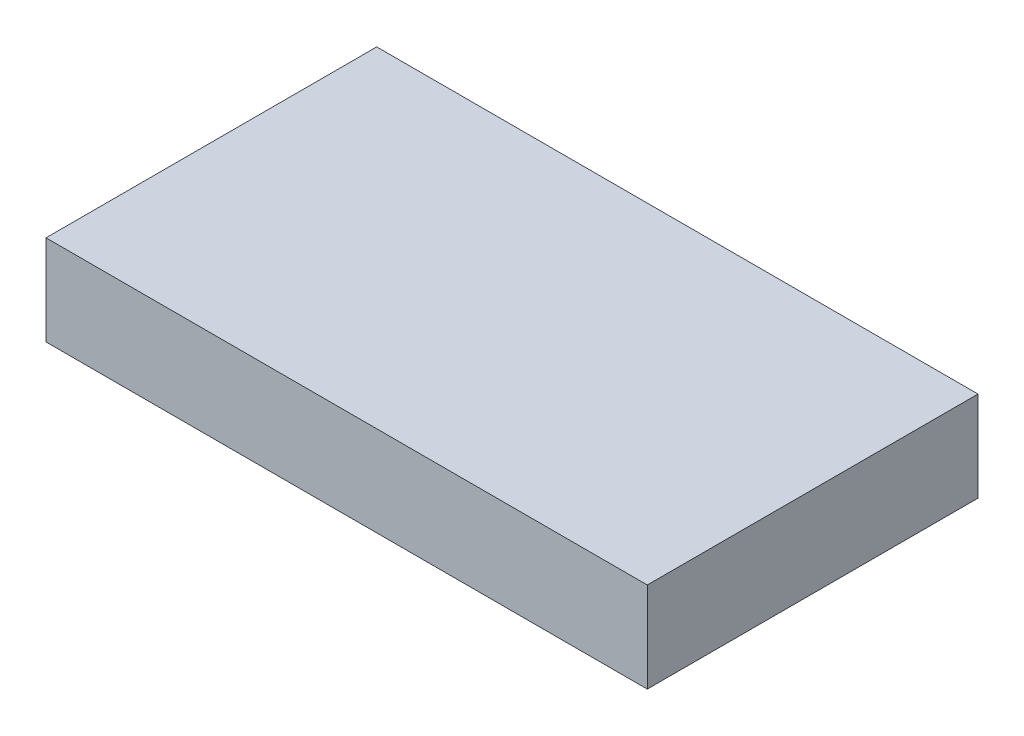
ISO-10303-21;
HEADER;
FILE_DESCRIPTION(('STEP AP214'),'2;1');
FILE_NAME('part.step','',(''),(''),'','','');
FILE_SCHEMA(('AUTOMOTIVE_DESIGN { 1 0 10303 214 1 1 1 1 }'));
ENDSEC;
DATA;
#1=APPLICATION_CONTEXT('core data for automotive mechanical design processes');
#2=APPLICATION_PROTOCOL_DEFINITION('international standard','automotive_design',2000,#1);
#3=PRODUCT_CONTEXT('',#1,'mechanical');
#4=PRODUCT('Part','Part','',(#3));
#5=PRODUCT_RELATED_PRODUCT_CATEGORY('part','',(#4));
#6=PRODUCT_DEFINITION_FORMATION('','',#4);
#7=PRODUCT_DEFINITION_CONTEXT('part definition',#1,'design');
#8=PRODUCT_DEFINITION('design','',#6,#7);
#9=PRODUCT_DEFINITION_SHAPE('','',#8);
#10=(LENGTH_UNIT() NAMED_UNIT(*) SI_UNIT(.MILLI.,.METRE.));
#11=(NAMED_UNIT(*) PLANE_ANGLE_UNIT() SI_UNIT($,.RADIAN.));
#12=(NAMED_UNIT(*) SI_UNIT($,.STERADIAN.) SOLID_ANGLE_UNIT());
#13=UNCERTAINTY_MEASURE_WITH_UNIT(LENGTH_MEASURE(1.E-05),#10,'distance_accuracy_value','');
#14=(GEOMETRIC_REPRESENTATION_CONTEXT(3) GLOBAL_UNCERTAINTY_ASSIGNED_CONTEXT((#13)) GLOBAL_UNIT_ASSIGNED_CONTEXT((#10,
#11,#12)) REPRESENTATION_CONTEXT('',''));
#15=CARTESIAN_POINT('',(0.,0.,0.));
#16=DIRECTION('',(0.,0.,1.));
#17=DIRECTION('',(1.,0.,0.));
#18=AXIS2_PLACEMENT_3D('',#15,#16,#17);
#19=CARTESIAN_POINT('',(100.,10.,0.));
#20=DIRECTION('',(0.,0.,-1.));
#21=DIRECTION('',(-1.,0.,0.));
#22=AXIS2_PLACEMENT_3D('',#19,#20,#21);
#23=PLANE('',#22);
#24=DIRECTION('',(1.,0.,0.));
#25=VECTOR('',#24,1.);
#26=CARTESIAN_POINT('',(100.,0.,0.));
#27=LINE('',#26,#25);
#28=CARTESIAN_POINT('',(0.,0.,0.));
#29=VERTEX_POINT('',#28);
#30=CARTESIAN_POINT('',(100.,0.,0.));
#31=VERTEX_POINT('',#30);
#32=EDGE_CURVE('E132',#29,#31,#27,.T.);
#33=ORIENTED_EDGE('',*,*,#32,.T.);
#34=DIRECTION('',(0.,-1.,0.));
#35=VECTOR('',#34,1.);
#36=CARTESIAN_POINT('',(100.,10.,0.));
#37=LINE('',#36,#35);
#38=CARTESIAN_POINT('',(100.,15.,0.));
#39=VERTEX_POINT('',#38);
#40=EDGE_CURVE('E11',#39,#31,#37,.T.);
#41=ORIENTED_EDGE('',*,*,#40,.F.);
#42=DIRECTION('',(1.,0.,0.));
#43=VECTOR('',#42,1.);
#44=CARTESIAN_POINT('',(0.,15.,0.));
#45=LINE('',#44,#43);
#46=CARTESIAN_POINT('',(0.,15.,0.));
#47=VERTEX_POINT('',#46);
#48=EDGE_CURVE('E117',#47,#39,#45,.T.);
#49=ORIENTED_EDGE('',*,*,#48,.F.);
#50=DIRECTION('',(0.,-1.,0.));
#51=VECTOR('',#50,1.);
#52=CARTESIAN_POINT('',(0.,10.,0.));
#53=LINE('',#52,#51);
#54=EDGE_CURVE('E105',#47,#29,#53,.T.);
#55=ORIENTED_EDGE('',*,*,#54,.T.);
#56=EDGE_LOOP('',(#33,#41,#49,#55));
#57=FACE_BOUND('',#56,.T.);
#58=ADVANCED_FACE('F33',(#57),#23,.F.);
#59=CARTESIAN_POINT('',(100.,10.,-55.));
#60=DIRECTION('',(-1.,0.,0.));
#61=DIRECTION('',(0.,0.,1.));
#62=AXIS2_PLACEMENT_3D('',#59,#60,#61);
#63=PLANE('',#62);
#64=DIRECTION('',(0.,0.,-1.));
#65=VECTOR('',#64,1.);
#66=CARTESIAN_POINT('',(100.,0.,-55.));
#67=LINE('',#66,#65);
#68=CARTESIAN_POINT('',(100.,0.,-55.));
#69=VERTEX_POINT('',#68);
#70=EDGE_CURVE('E143',#31,#69,#67,.T.);
#71=ORIENTED_EDGE('',*,*,#70,.T.);
#72=DIRECTION('',(0.,-1.,0.));
#73=VECTOR('',#72,1.);
#74=CARTESIAN_POINT('',(100.,10.,-55.));
#75=LINE('',#74,#73);
#76=CARTESIAN_POINT('',(100.,15.,-55.));
#77=VERTEX_POINT('',#76);
#78=EDGE_CURVE('E41',#77,#69,#75,.T.);
#79=ORIENTED_EDGE('',*,*,#78,.F.);
#80=DIRECTION('',(0.,0.,-1.));
#81=VECTOR('',#80,1.);
#82=CARTESIAN_POINT('',(100.,15.,0.));
#83=LINE('',#82,#81);
#84=EDGE_CURVE('E121',#39,#77,#83,.T.);
#85=ORIENTED_EDGE('',*,*,#84,.F.);
#86=ORIENTED_EDGE('',*,*,#40,.T.);
#87=EDGE_LOOP('',(#71,#79,#85,#86));
#88=FACE_BOUND('',#87,.T.);
#89=ADVANCED_FACE('F188',(#88),#63,.F.);
#90=CARTESIAN_POINT('',(91.,10.,-25.));
#91=DIRECTION('',(1.,0.,0.));
#92=DIRECTION('',(0.,0.,-1.));
#93=AXIS2_PLACEMENT_3D('',#90,#91,#92);
#94=PLANE('',#93);
#95=DIRECTION('',(0.,0.,1.));
#96=VECTOR('',#95,1.);
#97=CARTESIAN_POINT('',(91.,0.,-25.));
#98=LINE('',#97,#96);
#99=CARTESIAN_POINT('',(91.,0.,-55.));
#100=VERTEX_POINT('',#99);
#101=CARTESIAN_POINT('',(91.,0.,-25.));
#102=VERTEX_POINT('',#101);
#103=EDGE_CURVE('E147',#100,#102,#98,.T.);
#104=ORIENTED_EDGE('',*,*,#103,.T.);
#105=DIRECTION('',(0.,-1.,0.));
#106=VECTOR('',#105,1.);
#107=CARTESIAN_POINT('',(91.,10.,-25.));
#108=LINE('',#107,#106);
#109=CARTESIAN_POINT('',(91.,10.,-25.));
#110=VERTEX_POINT('',#109);
#111=EDGE_CURVE('E159',#110,#102,#108,.T.);
#112=ORIENTED_EDGE('',*,*,#111,.F.);
#113=DIRECTION('',(0.,0.,1.));
#114=VECTOR('',#113,1.);
#115=CARTESIAN_POINT('',(91.,10.,-25.));
#116=LINE('',#115,#114);
#117=CARTESIAN_POINT('',(91.,10.,-55.));
#118=VERTEX_POINT('',#117);
#119=EDGE_CURVE('E134',#118,#110,#116,.T.);
#120=ORIENTED_EDGE('',*,*,#119,.F.);
#121=DIRECTION('',(0.,-1.,0.));
#122=VECTOR('',#121,1.);
#123=CARTESIAN_POINT('',(91.,10.,-55.));
#124=LINE('',#123,#122);
#125=EDGE_CURVE('E90',#118,#100,#124,.T.);
#126=ORIENTED_EDGE('',*,*,#125,.T.);
#127=EDGE_LOOP('',(#104,#112,#120,#126));
#128=FACE_BOUND('',#127,.T.);
#129=ADVANCED_FACE('F172',(#128),#94,.F.);
#130=CARTESIAN_POINT('',(9.00000000000001,10.,-25.));
#131=DIRECTION('',(0.,0.,1.));
#132=DIRECTION('',(1.,0.,0.));
#133=AXIS2_PLACEMENT_3D('',#130,#131,#132);
#134=PLANE('',#133);
#135=DIRECTION('',(-1.,0.,0.));
#136=VECTOR('',#135,1.);
#137=CARTESIAN_POINT('',(9.00000000000001,0.,-25.));
#138=LINE('',#137,#136);
#139=CARTESIAN_POINT('',(9.00000000000001,0.,-25.));
#140=VERTEX_POINT('',#139);
#141=EDGE_CURVE('E149',#102,#140,#138,.T.);
#142=ORIENTED_EDGE('',*,*,#141,.T.);
#143=DIRECTION('',(0.,-1.,0.));
#144=VECTOR('',#143,1.);
#145=CARTESIAN_POINT('',(9.00000000000001,10.,-25.));
#146=LINE('',#145,#144);
#147=CARTESIAN_POINT('',(9.00000000000001,10.,-25.));
#148=VERTEX_POINT('',#147);
#149=EDGE_CURVE('E49',#148,#140,#146,.T.);
#150=ORIENTED_EDGE('',*,*,#149,.F.);
#151=DIRECTION('',(-1.,0.,0.));
#152=VECTOR('',#151,1.);
#153=CARTESIAN_POINT('',(9.00000000000001,10.,-25.));
#154=LINE('',#153,#152);
#155=EDGE_CURVE('E137',#110,#148,#154,.T.);
#156=ORIENTED_EDGE('',*,*,#155,.F.);
#157=ORIENTED_EDGE('',*,*,#111,.T.);
#158=EDGE_LOOP('',(#142,#150,#156,#157));
#159=FACE_BOUND('',#158,.T.);
#160=ADVANCED_FACE('F173',(#159),#134,.F.);
#161=CARTESIAN_POINT('',(9.,10.,-55.));
#162=DIRECTION('',(-1.,0.,0.));
#163=DIRECTION('',(0.,0.,1.));
#164=AXIS2_PLACEMENT_3D('',#161,#162,#163);
#165=PLANE('',#164);
#166=DIRECTION('',(0.,0.,-1.));
#167=VECTOR('',#166,1.);
#168=CARTESIAN_POINT('',(9.,0.,-55.));
#169=LINE('',#168,#167);
#170=CARTESIAN_POINT('',(9.,0.,-55.));
#171=VERTEX_POINT('',#170);
#172=EDGE_CURVE('E151',#140,#171,#169,.T.);
#173=ORIENTED_EDGE('',*,*,#172,.T.);
#174=DIRECTION('',(0.,-1.,0.));
#175=VECTOR('',#174,1.);
#176=CARTESIAN_POINT('',(9.,10.,-55.));
#177=LINE('',#176,#175);
#178=CARTESIAN_POINT('',(9.,10.,-55.));
#179=VERTEX_POINT('',#178);
#180=EDGE_CURVE('E156',#179,#171,#177,.T.);
#181=ORIENTED_EDGE('',*,*,#180,.F.);
#182=DIRECTION('',(0.,0.,-1.));
#183=VECTOR('',#182,1.);
#184=CARTESIAN_POINT('',(9.,10.,-55.));
#185=LINE('',#184,#183);
#186=EDGE_CURVE('E114',#148,#179,#185,.T.);
#187=ORIENTED_EDGE('',*,*,#186,.F.);
#188=ORIENTED_EDGE('',*,*,#149,.T.);
#189=EDGE_LOOP('',(#173,#181,#187,#188));
#190=FACE_BOUND('',#189,.T.);
#191=ADVANCED_FACE('F178',(#190),#165,.F.);
#192=CARTESIAN_POINT('',(0.,10.,-55.));
#193=DIRECTION('',(0.,0.,1.));
#194=DIRECTION('',(1.,0.,0.));
#195=AXIS2_PLACEMENT_3D('',#192,#193,#194);
#196=PLANE('',#195);
#197=DIRECTION('',(-1.,0.,0.));
#198=VECTOR('',#197,1.);
#199=CARTESIAN_POINT('',(0.,0.,-55.));
#200=LINE('',#199,#198);
#201=CARTESIAN_POINT('',(0.,0.,-55.));
#202=VERTEX_POINT('',#201);
#203=EDGE_CURVE('E79',#171,#202,#200,.T.);
#204=ORIENTED_EDGE('',*,*,#203,.T.);
#205=DIRECTION('',(0.,-1.,0.));
#206=VECTOR('',#205,1.);
#207=CARTESIAN_POINT('',(0.,10.,-55.));
#208=LINE('',#207,#206);
#209=CARTESIAN_POINT('',(0.,15.,-55.));
#210=VERTEX_POINT('',#209);
#211=EDGE_CURVE('E113',#210,#202,#208,.T.);
#212=ORIENTED_EDGE('',*,*,#211,.F.);
#213=DIRECTION('',(-1.,0.,0.));
#214=VECTOR('',#213,1.);
#215=CARTESIAN_POINT('',(0.,15.,-55.));
#216=LINE('',#215,#214);
#217=EDGE_CURVE('E126',#77,#210,#216,.T.);
#218=ORIENTED_EDGE('',*,*,#217,.F.);
#219=ORIENTED_EDGE('',*,*,#78,.T.);
#220=DIRECTION('',(-1.,0.,0.));
#221=VECTOR('',#220,1.);
#222=CARTESIAN_POINT('',(91.,0.,-55.));
#223=LINE('',#222,#221);
#224=EDGE_CURVE('E145',#69,#100,#223,.T.);
#225=ORIENTED_EDGE('',*,*,#224,.T.);
#226=ORIENTED_EDGE('',*,*,#125,.F.);
#227=DIRECTION('',(-1.,0.,0.));
#228=VECTOR('',#227,1.);
#229=CARTESIAN_POINT('',(0.,10.,-55.));
#230=LINE('',#229,#228);
#231=EDGE_CURVE('E127',#118,#179,#230,.T.);
#232=ORIENTED_EDGE('',*,*,#231,.T.);
#233=ORIENTED_EDGE('',*,*,#180,.T.);
#234=EDGE_LOOP('',(#204,#212,#218,#219,#225,#226,#232,#233));
#235=FACE_BOUND('',#234,.T.);
#236=ADVANCED_FACE('F164',(#235),#196,.F.);
#237=CARTESIAN_POINT('',(0.,10.,0.));
#238=DIRECTION('',(1.,0.,0.));
#239=DIRECTION('',(0.,0.,-1.));
#240=AXIS2_PLACEMENT_3D('',#237,#238,#239);
#241=PLANE('',#240);
#242=DIRECTION('',(0.,0.,1.));
#243=VECTOR('',#242,1.);
#244=CARTESIAN_POINT('',(0.,0.,0.));
#245=LINE('',#244,#243);
#246=EDGE_CURVE('E85',#202,#29,#245,.T.);
#247=ORIENTED_EDGE('',*,*,#246,.T.);
#248=ORIENTED_EDGE('',*,*,#54,.F.);
#249=DIRECTION('',(0.,0.,1.));
#250=VECTOR('',#249,1.);
#251=CARTESIAN_POINT('',(0.,15.,0.));
#252=LINE('',#251,#250);
#253=EDGE_CURVE('E109',#210,#47,#252,.T.);
#254=ORIENTED_EDGE('',*,*,#253,.F.);
#255=ORIENTED_EDGE('',*,*,#211,.T.);
#256=EDGE_LOOP('',(#247,#248,#254,#255));
#257=FACE_BOUND('',#256,.T.);
#258=ADVANCED_FACE('F107',(#257),#241,.F.);
#259=CARTESIAN_POINT('',(0.,0.,0.));
#260=DIRECTION('',(0.,-1.,0.));
#261=DIRECTION('',(0.,0.,-1.));
#262=AXIS2_PLACEMENT_3D('',#259,#260,#261);
#263=PLANE('',#262);
#264=ORIENTED_EDGE('',*,*,#32,.F.);
#265=ORIENTED_EDGE('',*,*,#246,.F.);
#266=ORIENTED_EDGE('',*,*,#203,.F.);
#267=ORIENTED_EDGE('',*,*,#172,.F.);
#268=ORIENTED_EDGE('',*,*,#141,.F.);
#269=ORIENTED_EDGE('',*,*,#103,.F.);
#270=ORIENTED_EDGE('',*,*,#224,.F.);
#271=ORIENTED_EDGE('',*,*,#70,.F.);
#272=EDGE_LOOP('',(#264,#265,#266,#267,#268,#269,#270,#271));
#273=FACE_BOUND('',#272,.T.);
#274=ADVANCED_FACE('F168',(#273),#263,.T.);
#275=CARTESIAN_POINT('',(0.,15.,0.));
#276=DIRECTION('',(0.,-1.,0.));
#277=DIRECTION('',(0.,0.,-1.));
#278=AXIS2_PLACEMENT_3D('',#275,#276,#277);
#279=PLANE('',#278);
#280=ORIENTED_EDGE('',*,*,#253,.T.);
#281=ORIENTED_EDGE('',*,*,#48,.T.);
#282=ORIENTED_EDGE('',*,*,#84,.T.);
#283=ORIENTED_EDGE('',*,*,#217,.T.);
#284=EDGE_LOOP('',(#280,#281,#282,#283));
#285=FACE_BOUND('',#284,.T.);
#286=ADVANCED_FACE('F124',(#285),#279,.F.);
#287=CARTESIAN_POINT('',(0.,10.,0.));
#288=DIRECTION('',(0.,-1.,0.));
#289=DIRECTION('',(0.,0.,-1.));
#290=AXIS2_PLACEMENT_3D('',#287,#288,#289);
#291=PLANE('',#290);
#292=ORIENTED_EDGE('',*,*,#231,.F.);
#293=ORIENTED_EDGE('',*,*,#119,.T.);
#294=ORIENTED_EDGE('',*,*,#155,.T.);
#295=ORIENTED_EDGE('',*,*,#186,.T.);
#296=EDGE_LOOP('',(#292,#293,#294,#295));
#297=FACE_BOUND('',#296,.T.);
#298=ADVANCED_FACE('F176',(#297),#291,.T.);
#299=CLOSED_SHELL('',(#58,#89,#129,#160,#191,#236,#258,#274,#286,#298));
#300=MANIFOLD_SOLID_BREP('B2',#299);
#301=ADVANCED_BREP_SHAPE_REPRESENTATION('',(#18,#300),#14);
#302=SHAPE_DEFINITION_REPRESENTATION(#9,#301);
ENDSEC;
END-ISO-10303-21;
